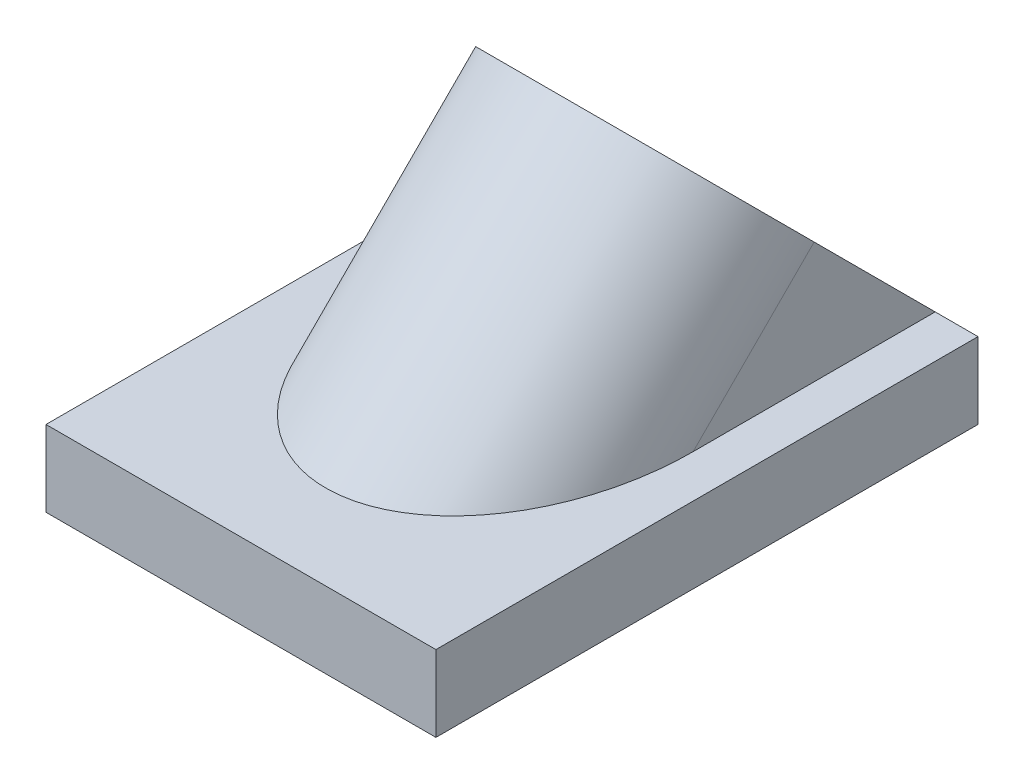
ISO-10303-21;
HEADER;
FILE_DESCRIPTION(('STEP AP214'),'2;1');
FILE_NAME('part.step','',(''),(''),'','','');
FILE_SCHEMA(('AUTOMOTIVE_DESIGN { 1 0 10303 214 1 1 1 1 }'));
ENDSEC;
DATA;
#1=APPLICATION_CONTEXT('core data for automotive mechanical design processes');
#2=APPLICATION_PROTOCOL_DEFINITION('international standard','automotive_design',2000,#1);
#3=PRODUCT_CONTEXT('',#1,'mechanical');
#4=PRODUCT('Part','Part','',(#3));
#5=PRODUCT_RELATED_PRODUCT_CATEGORY('part','',(#4));
#6=PRODUCT_DEFINITION_FORMATION('','',#4);
#7=PRODUCT_DEFINITION_CONTEXT('part definition',#1,'design');
#8=PRODUCT_DEFINITION('design','',#6,#7);
#9=PRODUCT_DEFINITION_SHAPE('','',#8);
#10=(LENGTH_UNIT() NAMED_UNIT(*) SI_UNIT(.MILLI.,.METRE.));
#11=(NAMED_UNIT(*) PLANE_ANGLE_UNIT() SI_UNIT($,.RADIAN.));
#12=(NAMED_UNIT(*) SI_UNIT($,.STERADIAN.) SOLID_ANGLE_UNIT());
#13=UNCERTAINTY_MEASURE_WITH_UNIT(LENGTH_MEASURE(1.E-05),#10,'distance_accuracy_value','');
#14=(GEOMETRIC_REPRESENTATION_CONTEXT(3) GLOBAL_UNCERTAINTY_ASSIGNED_CONTEXT((#13)) GLOBAL_UNIT_ASSIGNED_CONTEXT((#10,
#11,#12)) REPRESENTATION_CONTEXT('',''));
#15=CARTESIAN_POINT('',(0.,0.,0.));
#16=DIRECTION('',(0.,0.,1.));
#17=DIRECTION('',(1.,0.,0.));
#18=AXIS2_PLACEMENT_3D('',#15,#16,#17);
#19=CARTESIAN_POINT('',(-41.,0.,28.5));
#20=DIRECTION('',(0.,1.,0.));
#21=DIRECTION('',(0.,0.,1.));
#22=AXIS2_PLACEMENT_3D('',#19,#20,#21);
#23=PLANE('',#22);
#24=DIRECTION('',(1.,0.,0.));
#25=VECTOR('',#24,1.);
#26=CARTESIAN_POINT('',(-41.,0.,-28.5));
#27=LINE('',#26,#25);
#28=CARTESIAN_POINT('',(-4.5,0.,-28.5));
#29=VERTEX_POINT('',#28);
#30=CARTESIAN_POINT('',(0.,0.,-28.5));
#31=VERTEX_POINT('',#30);
#32=EDGE_CURVE('E137',#29,#31,#27,.T.);
#33=ORIENTED_EDGE('',*,*,#32,.F.);
#34=DIRECTION('',(0.,0.,1.));
#35=VECTOR('',#34,1.);
#36=CARTESIAN_POINT('',(-4.5,0.,16.7293362749202));
#37=LINE('',#36,#35);
#38=CARTESIAN_POINT('',(-4.5,0.,-3.04415587728434));
#39=VERTEX_POINT('',#38);
#40=EDGE_CURVE('E109',#29,#39,#37,.T.);
#41=ORIENTED_EDGE('',*,*,#40,.T.);
#42=CARTESIAN_POINT('',(-20.5,0.,-3.04415587728434));
#43=DIRECTION('',(0.,1.,0.));
#44=DIRECTION('',(0.,0.,-1.));
#45=AXIS2_PLACEMENT_3D('',#42,#43,#44);
#46=ELLIPSE('',#45,22.6274169979695,16.);
#47=CARTESIAN_POINT('',(-36.5,0.,-3.04415587728434));
#48=VERTEX_POINT('',#47);
#49=EDGE_CURVE('E115',#39,#48,#46,.F.);
#50=ORIENTED_EDGE('',*,*,#49,.T.);
#51=DIRECTION('',(0.,0.,-1.));
#52=VECTOR('',#51,1.);
#53=CARTESIAN_POINT('',(-36.5,0.,16.7293362749202));
#54=LINE('',#53,#52);
#55=CARTESIAN_POINT('',(-36.5,0.,-28.5));
#56=VERTEX_POINT('',#55);
#57=EDGE_CURVE('E104',#48,#56,#54,.T.);
#58=ORIENTED_EDGE('',*,*,#57,.T.);
#59=CARTESIAN_POINT('',(-41.,0.,-28.5));
#60=VERTEX_POINT('',#59);
#61=EDGE_CURVE('E43',#60,#56,#27,.T.);
#62=ORIENTED_EDGE('',*,*,#61,.F.);
#63=DIRECTION('',(0.,0.,1.));
#64=VECTOR('',#63,1.);
#65=CARTESIAN_POINT('',(-41.,0.,28.5));
#66=LINE('',#65,#64);
#67=CARTESIAN_POINT('',(-41.,0.,28.5));
#68=VERTEX_POINT('',#67);
#69=EDGE_CURVE('E129',#60,#68,#66,.T.);
#70=ORIENTED_EDGE('',*,*,#69,.T.);
#71=DIRECTION('',(1.,0.,0.));
#72=VECTOR('',#71,1.);
#73=CARTESIAN_POINT('',(-41.,0.,28.5));
#74=LINE('',#73,#72);
#75=CARTESIAN_POINT('',(0.,0.,28.5));
#76=VERTEX_POINT('',#75);
#77=EDGE_CURVE('E149',#68,#76,#74,.T.);
#78=ORIENTED_EDGE('',*,*,#77,.T.);
#79=DIRECTION('',(0.,0.,1.));
#80=VECTOR('',#79,1.);
#81=CARTESIAN_POINT('',(0.,0.,28.5));
#82=LINE('',#81,#80);
#83=EDGE_CURVE('E141',#31,#76,#82,.T.);
#84=ORIENTED_EDGE('',*,*,#83,.F.);
#85=EDGE_LOOP('',(#33,#41,#50,#58,#62,#70,#78,#84));
#86=FACE_BOUND('',#85,.T.);
#87=ADVANCED_FACE('F39',(#86),#23,.T.);
#88=CARTESIAN_POINT('',(-41.,-8.,-28.5));
#89=DIRECTION('',(0.,0.,-1.));
#90=DIRECTION('',(-1.,0.,0.));
#91=AXIS2_PLACEMENT_3D('',#88,#89,#90);
#92=PLANE('',#91);
#93=DIRECTION('',(0.,1.,0.));
#94=VECTOR('',#93,1.);
#95=CARTESIAN_POINT('',(0.,-8.,-28.5));
#96=LINE('',#95,#94);
#97=CARTESIAN_POINT('',(0.,-8.,-28.5));
#98=VERTEX_POINT('',#97);
#99=EDGE_CURVE('E138',#98,#31,#96,.T.);
#100=ORIENTED_EDGE('',*,*,#99,.F.);
#101=DIRECTION('',(1.,0.,0.));
#102=VECTOR('',#101,1.);
#103=CARTESIAN_POINT('',(-41.,-8.,-28.5));
#104=LINE('',#103,#102);
#105=CARTESIAN_POINT('',(-41.,-8.,-28.5));
#106=VERTEX_POINT('',#105);
#107=EDGE_CURVE('E11',#106,#98,#104,.T.);
#108=ORIENTED_EDGE('',*,*,#107,.F.);
#109=DIRECTION('',(0.,1.,0.));
#110=VECTOR('',#109,1.);
#111=CARTESIAN_POINT('',(-41.,-8.,-28.5));
#112=LINE('',#111,#110);
#113=EDGE_CURVE('E127',#106,#60,#112,.T.);
#114=ORIENTED_EDGE('',*,*,#113,.T.);
#115=ORIENTED_EDGE('',*,*,#61,.T.);
#116=DIRECTION('',(-1.,0.,0.));
#117=VECTOR('',#116,1.);
#118=CARTESIAN_POINT('',(-4.5,0.,-28.5));
#119=LINE('',#118,#117);
#120=EDGE_CURVE('E153',#29,#56,#119,.T.);
#121=ORIENTED_EDGE('',*,*,#120,.F.);
#122=ORIENTED_EDGE('',*,*,#32,.T.);
#123=EDGE_LOOP('',(#100,#108,#114,#115,#121,#122));
#124=FACE_BOUND('',#123,.T.);
#125=ADVANCED_FACE('F41',(#124),#92,.T.);
#126=CARTESIAN_POINT('',(-41.,-8.,28.5));
#127=DIRECTION('',(0.,-1.,0.));
#128=DIRECTION('',(0.,0.,-1.));
#129=AXIS2_PLACEMENT_3D('',#126,#127,#128);
#130=PLANE('',#129);
#131=CARTESIAN_POINT('',(-20.5,-8.,4.95584412271563));
#132=DIRECTION('',(0.,-1.,0.));
#133=DIRECTION('',(0.,0.,-1.));
#134=AXIS2_PLACEMENT_3D('',#131,#132,#133);
#135=ELLIPSE('',#134,11.3137084989847,8.);
#136=CARTESIAN_POINT('',(-20.5,-8.,-6.35786437626911));
#137=VERTEX_POINT('',#136);
#138=EDGE_CURVE('E110',#137,#137,#135,.T.);
#139=ORIENTED_EDGE('',*,*,#138,.F.);
#140=EDGE_LOOP('',(#139));
#141=FACE_BOUND('',#140,.T.);
#142=DIRECTION('',(0.,0.,-1.));
#143=VECTOR('',#142,1.);
#144=CARTESIAN_POINT('',(0.,-8.,28.5));
#145=LINE('',#144,#143);
#146=CARTESIAN_POINT('',(0.,-8.,28.5));
#147=VERTEX_POINT('',#146);
#148=EDGE_CURVE('E130',#147,#98,#145,.T.);
#149=ORIENTED_EDGE('',*,*,#148,.F.);
#150=DIRECTION('',(1.,0.,0.));
#151=VECTOR('',#150,1.);
#152=CARTESIAN_POINT('',(-41.,-8.,28.5));
#153=LINE('',#152,#151);
#154=CARTESIAN_POINT('',(-41.,-8.,28.5));
#155=VERTEX_POINT('',#154);
#156=EDGE_CURVE('E48',#155,#147,#153,.T.);
#157=ORIENTED_EDGE('',*,*,#156,.F.);
#158=DIRECTION('',(0.,0.,-1.));
#159=VECTOR('',#158,1.);
#160=CARTESIAN_POINT('',(-41.,-8.,28.5));
#161=LINE('',#160,#159);
#162=EDGE_CURVE('E135',#155,#106,#161,.T.);
#163=ORIENTED_EDGE('',*,*,#162,.T.);
#164=ORIENTED_EDGE('',*,*,#107,.T.);
#165=EDGE_LOOP('',(#149,#157,#163,#164));
#166=FACE_BOUND('',#165,.T.);
#167=ADVANCED_FACE('F156',(#141,#166),#130,.T.);
#168=CARTESIAN_POINT('',(-41.,-8.,28.5));
#169=DIRECTION('',(0.,0.,1.));
#170=DIRECTION('',(1.,0.,0.));
#171=AXIS2_PLACEMENT_3D('',#168,#169,#170);
#172=PLANE('',#171);
#173=DIRECTION('',(0.,-1.,0.));
#174=VECTOR('',#173,1.);
#175=CARTESIAN_POINT('',(0.,-8.,28.5));
#176=LINE('',#175,#174);
#177=EDGE_CURVE('E144',#76,#147,#176,.T.);
#178=ORIENTED_EDGE('',*,*,#177,.F.);
#179=ORIENTED_EDGE('',*,*,#77,.F.);
#180=DIRECTION('',(0.,-1.,0.));
#181=VECTOR('',#180,1.);
#182=CARTESIAN_POINT('',(-41.,-8.,28.5));
#183=LINE('',#182,#181);
#184=EDGE_CURVE('E132',#68,#155,#183,.T.);
#185=ORIENTED_EDGE('',*,*,#184,.T.);
#186=ORIENTED_EDGE('',*,*,#156,.T.);
#187=EDGE_LOOP('',(#178,#179,#185,#186));
#188=FACE_BOUND('',#187,.T.);
#189=ADVANCED_FACE('F160',(#188),#172,.T.);
#190=CARTESIAN_POINT('',(-41.,0.,0.));
#191=DIRECTION('',(-1.,0.,0.));
#192=DIRECTION('',(0.,0.,1.));
#193=AXIS2_PLACEMENT_3D('',#190,#191,#192);
#194=PLANE('',#193);
#195=ORIENTED_EDGE('',*,*,#113,.F.);
#196=ORIENTED_EDGE('',*,*,#162,.F.);
#197=ORIENTED_EDGE('',*,*,#184,.F.);
#198=ORIENTED_EDGE('',*,*,#69,.F.);
#199=EDGE_LOOP('',(#195,#196,#197,#198));
#200=FACE_BOUND('',#199,.T.);
#201=ADVANCED_FACE('F162',(#200),#194,.T.);
#202=CARTESIAN_POINT('',(0.,0.,0.));
#203=DIRECTION('',(-1.,0.,0.));
#204=DIRECTION('',(0.,0.,1.));
#205=AXIS2_PLACEMENT_3D('',#202,#203,#204);
#206=PLANE('',#205);
#207=ORIENTED_EDGE('',*,*,#99,.T.);
#208=ORIENTED_EDGE('',*,*,#83,.T.);
#209=ORIENTED_EDGE('',*,*,#177,.T.);
#210=ORIENTED_EDGE('',*,*,#148,.T.);
#211=EDGE_LOOP('',(#207,#208,#209,#210));
#212=FACE_BOUND('',#211,.T.);
#213=ADVANCED_FACE('F155',(#212),#206,.F.);
#214=CARTESIAN_POINT('',(-36.5,-19.7734921522046,16.7293362749202));
#215=DIRECTION('',(-1.,0.,0.));
#216=DIRECTION('',(0.,0.,1.));
#217=AXIS2_PLACEMENT_3D('',#214,#215,#216);
#218=PLANE('',#217);
#219=ORIENTED_EDGE('',*,*,#57,.F.);
#220=DIRECTION('',(0.,0.707106781186549,-0.707106781186546));
#221=VECTOR('',#220,1.);
#222=CARTESIAN_POINT('',(-36.5,-19.7734921522046,16.7293362749202));
#223=LINE('',#222,#221);
#224=CARTESIAN_POINT('',(-36.5,12.7279220613578,-15.7720779386421));
#225=VERTEX_POINT('',#224);
#226=EDGE_CURVE('E107',#48,#225,#223,.T.);
#227=ORIENTED_EDGE('',*,*,#226,.T.);
#228=DIRECTION('',(0.,0.707106781186546,0.707106781186549));
#229=VECTOR('',#228,1.);
#230=CARTESIAN_POINT('',(-36.5,12.7279220613578,-15.7720779386421));
#231=LINE('',#230,#229);
#232=EDGE_CURVE('E56',#56,#225,#231,.T.);
#233=ORIENTED_EDGE('',*,*,#232,.F.);
#234=EDGE_LOOP('',(#219,#227,#233));
#235=FACE_BOUND('',#234,.T.);
#236=ADVANCED_FACE('F106',(#235),#218,.T.);
#237=CARTESIAN_POINT('',(-4.5,-19.7734921522046,16.7293362749202));
#238=DIRECTION('',(1.,0.,0.));
#239=DIRECTION('',(0.,0.,-1.));
#240=AXIS2_PLACEMENT_3D('',#237,#238,#239);
#241=PLANE('',#240);
#242=ORIENTED_EDGE('',*,*,#40,.F.);
#243=DIRECTION('',(0.,-0.707106781186546,-0.707106781186549));
#244=VECTOR('',#243,1.);
#245=CARTESIAN_POINT('',(-4.5,12.7279220613578,-15.7720779386421));
#246=LINE('',#245,#244);
#247=CARTESIAN_POINT('',(-4.5,12.7279220613578,-15.7720779386421));
#248=VERTEX_POINT('',#247);
#249=EDGE_CURVE('E192',#248,#29,#246,.T.);
#250=ORIENTED_EDGE('',*,*,#249,.F.);
#251=DIRECTION('',(0.,0.707106781186549,-0.707106781186546));
#252=VECTOR('',#251,1.);
#253=CARTESIAN_POINT('',(-4.5,-19.7734921522046,16.7293362749202));
#254=LINE('',#253,#252);
#255=EDGE_CURVE('E119',#39,#248,#254,.T.);
#256=ORIENTED_EDGE('',*,*,#255,.F.);
#257=EDGE_LOOP('',(#242,#250,#256));
#258=FACE_BOUND('',#257,.T.);
#259=ADVANCED_FACE('F198',(#258),#241,.T.);
#260=CARTESIAN_POINT('',(-20.5,-19.7734921522046,16.7293362749202));
#261=DIRECTION('',(0.,0.707106781186549,-0.707106781186546));
#262=DIRECTION('',(0.,0.707106781186546,0.707106781186549));
#263=AXIS2_PLACEMENT_3D('',#260,#261,#262);
#264=CYLINDRICAL_SURFACE('',#263,16.);
#265=ORIENTED_EDGE('',*,*,#49,.F.);
#266=ORIENTED_EDGE('',*,*,#255,.T.);
#267=CARTESIAN_POINT('',(-20.5,12.7279220613578,-15.7720779386421));
#268=DIRECTION('',(0.,0.707106781186549,-0.707106781186546));
#269=DIRECTION('',(0.,0.707106781186546,0.707106781186549));
#270=AXIS2_PLACEMENT_3D('',#267,#268,#269);
#271=CIRCLE('',#270,16.);
#272=EDGE_CURVE('E118',#225,#248,#271,.T.);
#273=ORIENTED_EDGE('',*,*,#272,.F.);
#274=ORIENTED_EDGE('',*,*,#226,.F.);
#275=EDGE_LOOP('',(#265,#266,#273,#274));
#276=FACE_BOUND('',#275,.T.);
#277=ADVANCED_FACE('F114',(#276),#264,.T.);
#278=CARTESIAN_POINT('',(-20.5,12.7279220613578,-15.7720779386421));
#279=DIRECTION('',(0.,0.707106781186549,-0.707106781186546));
#280=DIRECTION('',(0.,0.707106781186546,0.707106781186549));
#281=AXIS2_PLACEMENT_3D('',#278,#279,#280);
#282=PLANE('',#281);
#283=CARTESIAN_POINT('',(-20.5,12.7279220613578,-15.7720779386421));
#284=DIRECTION('',(0.,0.707106781186549,-0.707106781186546));
#285=DIRECTION('',(0.,0.707106781186546,0.707106781186549));
#286=AXIS2_PLACEMENT_3D('',#283,#284,#285);
#287=CIRCLE('',#286,8.);
#288=CARTESIAN_POINT('',(-20.5,18.3847763108502,-10.1152236891497));
#289=VERTEX_POINT('',#288);
#290=EDGE_CURVE('E185',#289,#289,#287,.T.);
#291=ORIENTED_EDGE('',*,*,#290,.F.);
#292=EDGE_LOOP('',(#291));
#293=FACE_BOUND('',#292,.T.);
#294=ORIENTED_EDGE('',*,*,#272,.T.);
#295=ORIENTED_EDGE('',*,*,#249,.T.);
#296=ORIENTED_EDGE('',*,*,#120,.T.);
#297=ORIENTED_EDGE('',*,*,#232,.T.);
#298=EDGE_LOOP('',(#294,#295,#296,#297));
#299=FACE_BOUND('',#298,.T.);
#300=ADVANCED_FACE('F170',(#293,#299),#282,.T.);
#301=CARTESIAN_POINT('',(-20.5,-16.2634559672907,13.2193000900063));
#302=DIRECTION('',(0.,0.707106781186549,-0.707106781186546));
#303=DIRECTION('',(0.,0.707106781186546,0.707106781186549));
#304=AXIS2_PLACEMENT_3D('',#301,#302,#303);
#305=CYLINDRICAL_SURFACE('',#304,8.);
#306=ORIENTED_EDGE('',*,*,#138,.T.);
#307=EDGE_LOOP('',(#306));
#308=FACE_BOUND('',#307,.T.);
#309=ORIENTED_EDGE('',*,*,#290,.T.);
#310=EDGE_LOOP('',(#309));
#311=FACE_BOUND('',#310,.T.);
#312=ADVANCED_FACE('F206',(#308,#311),#305,.F.);
#313=CLOSED_SHELL('',(#87,#125,#167,#189,#201,#213,#236,#259,#277,#300,#312));
#314=MANIFOLD_SOLID_BREP('B2',#313);
#315=ADVANCED_BREP_SHAPE_REPRESENTATION('',(#18,#314),#14);
#316=SHAPE_DEFINITION_REPRESENTATION(#9,#315);
ENDSEC;
END-ISO-10303-21;
